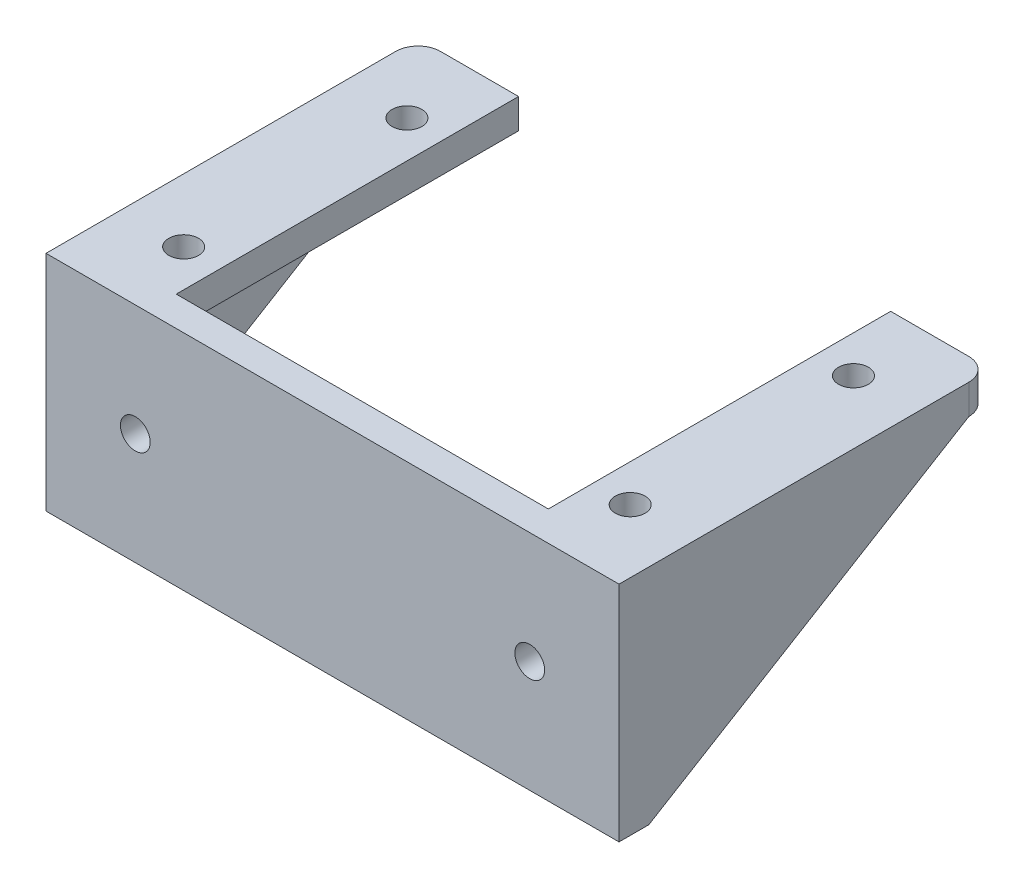
ISO-10303-21;
HEADER;
FILE_DESCRIPTION(('STEP AP214'),'2;1');
FILE_NAME('part.step','',(''),(''),'','','');
FILE_SCHEMA(('AUTOMOTIVE_DESIGN { 1 0 10303 214 1 1 1 1 }'));
ENDSEC;
DATA;
#1=APPLICATION_CONTEXT('core data for automotive mechanical design processes');
#2=APPLICATION_PROTOCOL_DEFINITION('international standard','automotive_design',2000,#1);
#3=PRODUCT_CONTEXT('',#1,'mechanical');
#4=PRODUCT('Part','Part','',(#3));
#5=PRODUCT_RELATED_PRODUCT_CATEGORY('part','',(#4));
#6=PRODUCT_DEFINITION_FORMATION('','',#4);
#7=PRODUCT_DEFINITION_CONTEXT('part definition',#1,'design');
#8=PRODUCT_DEFINITION('design','',#6,#7);
#9=PRODUCT_DEFINITION_SHAPE('','',#8);
#10=(LENGTH_UNIT() NAMED_UNIT(*) SI_UNIT(.MILLI.,.METRE.));
#11=(NAMED_UNIT(*) PLANE_ANGLE_UNIT() SI_UNIT($,.RADIAN.));
#12=(NAMED_UNIT(*) SI_UNIT($,.STERADIAN.) SOLID_ANGLE_UNIT());
#13=UNCERTAINTY_MEASURE_WITH_UNIT(LENGTH_MEASURE(1.E-05),#10,'distance_accuracy_value','');
#14=(GEOMETRIC_REPRESENTATION_CONTEXT(3) GLOBAL_UNCERTAINTY_ASSIGNED_CONTEXT((#13)) GLOBAL_UNIT_ASSIGNED_CONTEXT((#10,
#11,#12)) REPRESENTATION_CONTEXT('',''));
#15=CARTESIAN_POINT('',(0.,0.,0.));
#16=DIRECTION('',(0.,0.,1.));
#17=DIRECTION('',(1.,0.,0.));
#18=AXIS2_PLACEMENT_3D('',#15,#16,#17);
#19=CARTESIAN_POINT('',(25.,4.,21.));
#20=DIRECTION('',(0.,0.,1.));
#21=DIRECTION('',(1.,0.,0.));
#22=AXIS2_PLACEMENT_3D('',#19,#20,#21);
#23=PLANE('',#22);
#24=CARTESIAN_POINT('',(-26.5,-11.,21.));
#25=DIRECTION('',(0.,0.,1.));
#26=DIRECTION('',(1.,0.,0.));
#27=AXIS2_PLACEMENT_3D('',#24,#25,#26);
#28=CIRCLE('',#27,2.);
#29=CARTESIAN_POINT('',(-24.5,-11.,21.));
#30=VERTEX_POINT('',#29);
#31=EDGE_CURVE('E291',#30,#30,#28,.F.);
#32=ORIENTED_EDGE('',*,*,#31,.F.);
#33=EDGE_LOOP('',(#32));
#34=FACE_BOUND('',#33,.T.);
#35=CARTESIAN_POINT('',(26.5,-11.,21.));
#36=DIRECTION('',(0.,0.,1.));
#37=DIRECTION('',(1.,0.,0.));
#38=AXIS2_PLACEMENT_3D('',#35,#36,#37);
#39=CIRCLE('',#38,2.);
#40=CARTESIAN_POINT('',(28.5,-11.,21.));
#41=VERTEX_POINT('',#40);
#42=EDGE_CURVE('E190',#41,#41,#39,.F.);
#43=ORIENTED_EDGE('',*,*,#42,.F.);
#44=EDGE_LOOP('',(#43));
#45=FACE_BOUND('',#44,.T.);
#46=DIRECTION('',(1.,0.,0.));
#47=VECTOR('',#46,1.);
#48=CARTESIAN_POINT('',(38.5,0.,21.));
#49=LINE('',#48,#47);
#50=CARTESIAN_POINT('',(25.,0.,21.));
#51=VERTEX_POINT('',#50);
#52=CARTESIAN_POINT('',(34.5,0.,21.));
#53=VERTEX_POINT('',#52);
#54=EDGE_CURVE('E170',#51,#53,#49,.T.);
#55=ORIENTED_EDGE('',*,*,#54,.T.);
#56=DIRECTION('',(0.,-1.,0.));
#57=VECTOR('',#56,1.);
#58=CARTESIAN_POINT('',(34.5,0.,21.));
#59=LINE('',#58,#57);
#60=CARTESIAN_POINT('',(34.5,-26.,21.));
#61=VERTEX_POINT('',#60);
#62=EDGE_CURVE('E158',#53,#61,#59,.T.);
#63=ORIENTED_EDGE('',*,*,#62,.T.);
#64=DIRECTION('',(1.,0.,0.));
#65=VECTOR('',#64,1.);
#66=CARTESIAN_POINT('',(38.5,-26.,21.));
#67=LINE('',#66,#65);
#68=CARTESIAN_POINT('',(-34.5,-26.,21.));
#69=VERTEX_POINT('',#68);
#70=EDGE_CURVE('E167',#69,#61,#67,.T.);
#71=ORIENTED_EDGE('',*,*,#70,.F.);
#72=DIRECTION('',(0.,1.,0.));
#73=VECTOR('',#72,1.);
#74=CARTESIAN_POINT('',(-34.5,-26.,21.));
#75=LINE('',#74,#73);
#76=CARTESIAN_POINT('',(-34.5,0.,21.));
#77=VERTEX_POINT('',#76);
#78=EDGE_CURVE('E318',#69,#77,#75,.T.);
#79=ORIENTED_EDGE('',*,*,#78,.T.);
#80=CARTESIAN_POINT('',(-25.,0.,21.));
#81=VERTEX_POINT('',#80);
#82=EDGE_CURVE('E186',#77,#81,#49,.T.);
#83=ORIENTED_EDGE('',*,*,#82,.T.);
#84=DIRECTION('',(0.,-1.,0.));
#85=VECTOR('',#84,1.);
#86=CARTESIAN_POINT('',(-25.,4.,21.));
#87=LINE('',#86,#85);
#88=CARTESIAN_POINT('',(-25.,4.,21.));
#89=VERTEX_POINT('',#88);
#90=EDGE_CURVE('E219',#89,#81,#87,.T.);
#91=ORIENTED_EDGE('',*,*,#90,.F.);
#92=DIRECTION('',(-1.,0.,0.));
#93=VECTOR('',#92,1.);
#94=CARTESIAN_POINT('',(25.,4.,21.));
#95=LINE('',#94,#93);
#96=CARTESIAN_POINT('',(25.,4.,21.));
#97=VERTEX_POINT('',#96);
#98=EDGE_CURVE('E195',#97,#89,#95,.T.);
#99=ORIENTED_EDGE('',*,*,#98,.F.);
#100=DIRECTION('',(0.,-1.,0.));
#101=VECTOR('',#100,1.);
#102=CARTESIAN_POINT('',(25.,4.,21.));
#103=LINE('',#102,#101);
#104=EDGE_CURVE('E204',#97,#51,#103,.T.);
#105=ORIENTED_EDGE('',*,*,#104,.T.);
#106=EDGE_LOOP('',(#55,#63,#71,#79,#83,#91,#99,#105));
#107=FACE_BOUND('',#106,.T.);
#108=ADVANCED_FACE('F39',(#34,#45,#107),#23,.F.);
#109=CARTESIAN_POINT('',(0.,0.,0.));
#110=DIRECTION('',(0.,-1.,0.));
#111=DIRECTION('',(0.,0.,-1.));
#112=AXIS2_PLACEMENT_3D('',#109,#110,#111);
#113=PLANE('',#112);
#114=CARTESIAN_POINT('',(-30.,0.,15.));
#115=DIRECTION('',(0.,-1.,0.));
#116=DIRECTION('',(0.,0.,-1.));
#117=AXIS2_PLACEMENT_3D('',#114,#115,#116);
#118=CIRCLE('',#117,2.);
#119=CARTESIAN_POINT('',(-30.,0.,13.));
#120=VERTEX_POINT('',#119);
#121=EDGE_CURVE('E347',#120,#120,#118,.F.);
#122=ORIENTED_EDGE('',*,*,#121,.T.);
#123=EDGE_LOOP('',(#122));
#124=FACE_BOUND('',#123,.T.);
#125=CARTESIAN_POINT('',(-30.,0.,-15.));
#126=DIRECTION('',(0.,-1.,0.));
#127=DIRECTION('',(0.,0.,-1.));
#128=AXIS2_PLACEMENT_3D('',#125,#126,#127);
#129=CIRCLE('',#128,2.);
#130=CARTESIAN_POINT('',(-30.,0.,-17.));
#131=VERTEX_POINT('',#130);
#132=EDGE_CURVE('E330',#131,#131,#129,.F.);
#133=ORIENTED_EDGE('',*,*,#132,.T.);
#134=EDGE_LOOP('',(#133));
#135=FACE_BOUND('',#134,.T.);
#136=DIRECTION('',(-1.,0.,0.));
#137=VECTOR('',#136,1.);
#138=CARTESIAN_POINT('',(-34.5,0.,-22.));
#139=LINE('',#138,#137);
#140=CARTESIAN_POINT('',(-34.5,0.,-22.));
#141=VERTEX_POINT('',#140);
#142=CARTESIAN_POINT('',(-38.5,0.,-22.));
#143=VERTEX_POINT('',#142);
#144=EDGE_CURVE('E300',#141,#143,#139,.T.);
#145=ORIENTED_EDGE('',*,*,#144,.T.);
#146=CARTESIAN_POINT('',(-35.5,0.,-22.));
#147=DIRECTION('',(0.,-1.,0.));
#148=DIRECTION('',(0.,0.,-1.));
#149=AXIS2_PLACEMENT_3D('',#146,#147,#148);
#150=CIRCLE('',#149,3.);
#151=CARTESIAN_POINT('',(-35.5,0.,-25.));
#152=VERTEX_POINT('',#151);
#153=EDGE_CURVE('E252',#143,#152,#150,.T.);
#154=ORIENTED_EDGE('',*,*,#153,.T.);
#155=DIRECTION('',(-1.,0.,0.));
#156=VECTOR('',#155,1.);
#157=CARTESIAN_POINT('',(-38.5,0.,-25.));
#158=LINE('',#157,#156);
#159=CARTESIAN_POINT('',(-25.,0.,-25.));
#160=VERTEX_POINT('',#159);
#161=EDGE_CURVE('E214',#160,#152,#158,.T.);
#162=ORIENTED_EDGE('',*,*,#161,.F.);
#163=DIRECTION('',(0.,0.,-1.));
#164=VECTOR('',#163,1.);
#165=CARTESIAN_POINT('',(-25.,0.,-25.));
#166=LINE('',#165,#164);
#167=EDGE_CURVE('E196',#81,#160,#166,.T.);
#168=ORIENTED_EDGE('',*,*,#167,.F.);
#169=ORIENTED_EDGE('',*,*,#82,.F.);
#170=DIRECTION('',(0.,0.,-1.));
#171=VECTOR('',#170,1.);
#172=CARTESIAN_POINT('',(-34.5,0.,21.));
#173=LINE('',#172,#171);
#174=EDGE_CURVE('E310',#77,#141,#173,.T.);
#175=ORIENTED_EDGE('',*,*,#174,.T.);
#176=EDGE_LOOP('',(#145,#154,#162,#168,#169,#175));
#177=FACE_BOUND('',#176,.T.);
#178=ADVANCED_FACE('F387',(#124,#135,#177),#113,.T.);
#179=CARTESIAN_POINT('',(-38.5,4.,-25.));
#180=DIRECTION('',(0.,0.,1.));
#181=DIRECTION('',(1.,0.,0.));
#182=AXIS2_PLACEMENT_3D('',#179,#180,#181);
#183=PLANE('',#182);
#184=DIRECTION('',(-1.,0.,0.));
#185=VECTOR('',#184,1.);
#186=CARTESIAN_POINT('',(-38.5,4.,-25.));
#187=LINE('',#186,#185);
#188=CARTESIAN_POINT('',(35.5,4.,-25.));
#189=VERTEX_POINT('',#188);
#190=CARTESIAN_POINT('',(25.,4.,-25.));
#191=VERTEX_POINT('',#190);
#192=EDGE_CURVE('E231',#189,#191,#187,.T.);
#193=ORIENTED_EDGE('',*,*,#192,.F.);
#194=DIRECTION('',(0.,-1.,0.));
#195=VECTOR('',#194,1.);
#196=CARTESIAN_POINT('',(35.5,4.,-25.));
#197=LINE('',#196,#195);
#198=CARTESIAN_POINT('',(35.5,0.,-25.));
#199=VERTEX_POINT('',#198);
#200=EDGE_CURVE('E264',#189,#199,#197,.T.);
#201=ORIENTED_EDGE('',*,*,#200,.T.);
#202=CARTESIAN_POINT('',(25.,0.,-25.));
#203=VERTEX_POINT('',#202);
#204=EDGE_CURVE('E230',#199,#203,#158,.T.);
#205=ORIENTED_EDGE('',*,*,#204,.T.);
#206=DIRECTION('',(0.,-1.,0.));
#207=VECTOR('',#206,1.);
#208=CARTESIAN_POINT('',(25.,4.,-25.));
#209=LINE('',#208,#207);
#210=EDGE_CURVE('E210',#191,#203,#209,.T.);
#211=ORIENTED_EDGE('',*,*,#210,.F.);
#212=EDGE_LOOP('',(#193,#201,#205,#211));
#213=FACE_BOUND('',#212,.T.);
#214=ADVANCED_FACE('F393',(#213),#183,.F.);
#215=CARTESIAN_POINT('',(38.5,4.,25.));
#216=DIRECTION('',(-1.,0.,0.));
#217=DIRECTION('',(0.,0.,1.));
#218=AXIS2_PLACEMENT_3D('',#215,#216,#217);
#219=PLANE('',#218);
#220=DIRECTION('',(0.,0.,1.));
#221=VECTOR('',#220,1.);
#222=CARTESIAN_POINT('',(38.5,-26.,25.));
#223=LINE('',#222,#221);
#224=CARTESIAN_POINT('',(38.5,-26.,21.));
#225=VERTEX_POINT('',#224);
#226=CARTESIAN_POINT('',(38.5,-26.,25.));
#227=VERTEX_POINT('',#226);
#228=EDGE_CURVE('E189',#225,#227,#223,.T.);
#229=ORIENTED_EDGE('',*,*,#228,.F.);
#230=DIRECTION('',(0.,0.517419338909194,-0.855731983580591));
#231=VECTOR('',#230,1.);
#232=CARTESIAN_POINT('',(38.5,-26.,21.));
#233=LINE('',#232,#231);
#234=CARTESIAN_POINT('',(38.5,0.,-22.));
#235=VERTEX_POINT('',#234);
#236=EDGE_CURVE('E146',#225,#235,#233,.T.);
#237=ORIENTED_EDGE('',*,*,#236,.T.);
#238=DIRECTION('',(0.,-1.,0.));
#239=VECTOR('',#238,1.);
#240=CARTESIAN_POINT('',(38.5,4.,-22.));
#241=LINE('',#240,#239);
#242=CARTESIAN_POINT('',(38.5,4.,-22.));
#243=VERTEX_POINT('',#242);
#244=EDGE_CURVE('E11',#235,#243,#241,.F.);
#245=ORIENTED_EDGE('',*,*,#244,.T.);
#246=DIRECTION('',(0.,0.,-1.));
#247=VECTOR('',#246,1.);
#248=CARTESIAN_POINT('',(38.5,4.,25.));
#249=LINE('',#248,#247);
#250=CARTESIAN_POINT('',(38.5,4.,25.));
#251=VERTEX_POINT('',#250);
#252=EDGE_CURVE('E225',#251,#243,#249,.T.);
#253=ORIENTED_EDGE('',*,*,#252,.F.);
#254=DIRECTION('',(0.,-1.,0.));
#255=VECTOR('',#254,1.);
#256=CARTESIAN_POINT('',(38.5,4.,25.));
#257=LINE('',#256,#255);
#258=EDGE_CURVE('E240',#251,#227,#257,.T.);
#259=ORIENTED_EDGE('',*,*,#258,.T.);
#260=EDGE_LOOP('',(#229,#237,#245,#253,#259));
#261=FACE_BOUND('',#260,.T.);
#262=ADVANCED_FACE('F274',(#261),#219,.F.);
#263=ORIENTED_EDGE('',*,*,#161,.T.);
#264=DIRECTION('',(0.,-1.,0.));
#265=VECTOR('',#264,1.);
#266=CARTESIAN_POINT('',(-35.5,4.,-25.));
#267=LINE('',#266,#265);
#268=CARTESIAN_POINT('',(-35.5,4.,-25.));
#269=VERTEX_POINT('',#268);
#270=EDGE_CURVE('E255',#152,#269,#267,.F.);
#271=ORIENTED_EDGE('',*,*,#270,.T.);
#272=CARTESIAN_POINT('',(-25.,4.,-25.));
#273=VERTEX_POINT('',#272);
#274=EDGE_CURVE('E229',#273,#269,#187,.T.);
#275=ORIENTED_EDGE('',*,*,#274,.F.);
#276=DIRECTION('',(0.,-1.,0.));
#277=VECTOR('',#276,1.);
#278=CARTESIAN_POINT('',(-25.,4.,-25.));
#279=LINE('',#278,#277);
#280=EDGE_CURVE('E215',#273,#160,#279,.T.);
#281=ORIENTED_EDGE('',*,*,#280,.T.);
#282=EDGE_LOOP('',(#263,#271,#275,#281));
#283=FACE_BOUND('',#282,.T.);
#284=ADVANCED_FACE('F414',(#283),#183,.F.);
#285=CARTESIAN_POINT('',(-38.5,4.,25.));
#286=DIRECTION('',(1.,0.,0.));
#287=DIRECTION('',(0.,0.,-1.));
#288=AXIS2_PLACEMENT_3D('',#285,#286,#287);
#289=PLANE('',#288);
#290=DIRECTION('',(0.,0.,1.));
#291=VECTOR('',#290,1.);
#292=CARTESIAN_POINT('',(-38.5,4.,25.));
#293=LINE('',#292,#291);
#294=CARTESIAN_POINT('',(-38.5,4.,-22.));
#295=VERTEX_POINT('',#294);
#296=CARTESIAN_POINT('',(-38.5,4.,25.));
#297=VERTEX_POINT('',#296);
#298=EDGE_CURVE('E234',#295,#297,#293,.T.);
#299=ORIENTED_EDGE('',*,*,#298,.F.);
#300=DIRECTION('',(0.,-1.,0.));
#301=VECTOR('',#300,1.);
#302=CARTESIAN_POINT('',(-38.5,4.,-22.));
#303=LINE('',#302,#301);
#304=EDGE_CURVE('E248',#295,#143,#303,.T.);
#305=ORIENTED_EDGE('',*,*,#304,.T.);
#306=DIRECTION('',(0.,-0.517419338909194,0.855731983580591));
#307=VECTOR('',#306,1.);
#308=CARTESIAN_POINT('',(-38.5,0.,-22.));
#309=LINE('',#308,#307);
#310=CARTESIAN_POINT('',(-38.5,-26.,21.));
#311=VERTEX_POINT('',#310);
#312=EDGE_CURVE('E311',#143,#311,#309,.T.);
#313=ORIENTED_EDGE('',*,*,#312,.T.);
#314=DIRECTION('',(0.,0.,-1.));
#315=VECTOR('',#314,1.);
#316=CARTESIAN_POINT('',(-38.5,-26.,25.));
#317=LINE('',#316,#315);
#318=CARTESIAN_POINT('',(-38.5,-26.,25.));
#319=VERTEX_POINT('',#318);
#320=EDGE_CURVE('E177',#319,#311,#317,.T.);
#321=ORIENTED_EDGE('',*,*,#320,.F.);
#322=DIRECTION('',(0.,-1.,0.));
#323=VECTOR('',#322,1.);
#324=CARTESIAN_POINT('',(-38.5,4.,25.));
#325=LINE('',#324,#323);
#326=EDGE_CURVE('E245',#297,#319,#325,.T.);
#327=ORIENTED_EDGE('',*,*,#326,.F.);
#328=EDGE_LOOP('',(#299,#305,#313,#321,#327));
#329=FACE_BOUND('',#328,.T.);
#330=ADVANCED_FACE('F410',(#329),#289,.F.);
#331=CARTESIAN_POINT('',(-38.5,4.,25.));
#332=DIRECTION('',(0.,0.,-1.));
#333=DIRECTION('',(-1.,0.,0.));
#334=AXIS2_PLACEMENT_3D('',#331,#332,#333);
#335=PLANE('',#334);
#336=CARTESIAN_POINT('',(26.5,-11.,25.));
#337=DIRECTION('',(0.,0.,1.));
#338=DIRECTION('',(1.,0.,0.));
#339=AXIS2_PLACEMENT_3D('',#336,#337,#338);
#340=CIRCLE('',#339,2.);
#341=CARTESIAN_POINT('',(28.5,-11.,25.));
#342=VERTEX_POINT('',#341);
#343=EDGE_CURVE('E295',#342,#342,#340,.T.);
#344=ORIENTED_EDGE('',*,*,#343,.F.);
#345=EDGE_LOOP('',(#344));
#346=FACE_BOUND('',#345,.T.);
#347=CARTESIAN_POINT('',(-26.5,-11.,25.));
#348=DIRECTION('',(0.,0.,1.));
#349=DIRECTION('',(1.,0.,0.));
#350=AXIS2_PLACEMENT_3D('',#347,#348,#349);
#351=CIRCLE('',#350,2.);
#352=CARTESIAN_POINT('',(-24.5,-11.,25.));
#353=VERTEX_POINT('',#352);
#354=EDGE_CURVE('E296',#353,#353,#351,.T.);
#355=ORIENTED_EDGE('',*,*,#354,.F.);
#356=EDGE_LOOP('',(#355));
#357=FACE_BOUND('',#356,.T.);
#358=ORIENTED_EDGE('',*,*,#326,.T.);
#359=DIRECTION('',(-1.,0.,0.));
#360=VECTOR('',#359,1.);
#361=CARTESIAN_POINT('',(38.5,-26.,25.));
#362=LINE('',#361,#360);
#363=EDGE_CURVE('E182',#227,#319,#362,.T.);
#364=ORIENTED_EDGE('',*,*,#363,.F.);
#365=ORIENTED_EDGE('',*,*,#258,.F.);
#366=DIRECTION('',(1.,0.,0.));
#367=VECTOR('',#366,1.);
#368=CARTESIAN_POINT('',(-38.5,4.,25.));
#369=LINE('',#368,#367);
#370=EDGE_CURVE('E237',#297,#251,#369,.T.);
#371=ORIENTED_EDGE('',*,*,#370,.F.);
#372=EDGE_LOOP('',(#358,#364,#365,#371));
#373=FACE_BOUND('',#372,.T.);
#374=ADVANCED_FACE('F285',(#346,#357,#373),#335,.F.);
#375=CARTESIAN_POINT('',(0.,4.,0.));
#376=DIRECTION('',(0.,-1.,0.));
#377=DIRECTION('',(0.,0.,-1.));
#378=AXIS2_PLACEMENT_3D('',#375,#376,#377);
#379=PLANE('',#378);
#380=CARTESIAN_POINT('',(-30.,4.,15.));
#381=DIRECTION('',(0.,1.,0.));
#382=DIRECTION('',(0.,0.,1.));
#383=AXIS2_PLACEMENT_3D('',#380,#381,#382);
#384=CIRCLE('',#383,2.);
#385=CARTESIAN_POINT('',(-30.,4.,17.));
#386=VERTEX_POINT('',#385);
#387=EDGE_CURVE('E334',#386,#386,#384,.T.);
#388=ORIENTED_EDGE('',*,*,#387,.F.);
#389=EDGE_LOOP('',(#388));
#390=FACE_BOUND('',#389,.T.);
#391=CARTESIAN_POINT('',(30.,4.,-15.));
#392=DIRECTION('',(0.,1.,0.));
#393=DIRECTION('',(0.,0.,1.));
#394=AXIS2_PLACEMENT_3D('',#391,#392,#393);
#395=CIRCLE('',#394,2.);
#396=CARTESIAN_POINT('',(30.,4.,-13.));
#397=VERTEX_POINT('',#396);
#398=EDGE_CURVE('E342',#397,#397,#395,.T.);
#399=ORIENTED_EDGE('',*,*,#398,.F.);
#400=EDGE_LOOP('',(#399));
#401=FACE_BOUND('',#400,.T.);
#402=CARTESIAN_POINT('',(30.,4.,15.));
#403=DIRECTION('',(0.,1.,0.));
#404=DIRECTION('',(0.,0.,1.));
#405=AXIS2_PLACEMENT_3D('',#402,#403,#404);
#406=CIRCLE('',#405,2.);
#407=CARTESIAN_POINT('',(30.,4.,17.));
#408=VERTEX_POINT('',#407);
#409=EDGE_CURVE('E343',#408,#408,#406,.T.);
#410=ORIENTED_EDGE('',*,*,#409,.F.);
#411=EDGE_LOOP('',(#410));
#412=FACE_BOUND('',#411,.T.);
#413=CARTESIAN_POINT('',(-30.,4.,-15.));
#414=DIRECTION('',(0.,1.,0.));
#415=DIRECTION('',(0.,0.,1.));
#416=AXIS2_PLACEMENT_3D('',#413,#414,#415);
#417=CIRCLE('',#416,2.);
#418=CARTESIAN_POINT('',(-30.,4.,-13.));
#419=VERTEX_POINT('',#418);
#420=EDGE_CURVE('E327',#419,#419,#417,.T.);
#421=ORIENTED_EDGE('',*,*,#420,.F.);
#422=EDGE_LOOP('',(#421));
#423=FACE_BOUND('',#422,.T.);
#424=ORIENTED_EDGE('',*,*,#274,.T.);
#425=CARTESIAN_POINT('',(-35.5,4.,-22.));
#426=DIRECTION('',(0.,-1.,0.));
#427=DIRECTION('',(0.,0.,-1.));
#428=AXIS2_PLACEMENT_3D('',#425,#426,#427);
#429=CIRCLE('',#428,3.);
#430=EDGE_CURVE('E261',#269,#295,#429,.F.);
#431=ORIENTED_EDGE('',*,*,#430,.T.);
#432=ORIENTED_EDGE('',*,*,#298,.T.);
#433=ORIENTED_EDGE('',*,*,#370,.T.);
#434=ORIENTED_EDGE('',*,*,#252,.T.);
#435=CARTESIAN_POINT('',(35.5,4.,-22.));
#436=DIRECTION('',(0.,-1.,0.));
#437=DIRECTION('',(0.,0.,-1.));
#438=AXIS2_PLACEMENT_3D('',#435,#436,#437);
#439=CIRCLE('',#438,3.);
#440=EDGE_CURVE('E258',#243,#189,#439,.F.);
#441=ORIENTED_EDGE('',*,*,#440,.T.);
#442=ORIENTED_EDGE('',*,*,#192,.T.);
#443=DIRECTION('',(0.,0.,1.));
#444=VECTOR('',#443,1.);
#445=CARTESIAN_POINT('',(25.,4.,-25.));
#446=LINE('',#445,#444);
#447=EDGE_CURVE('E191',#191,#97,#446,.T.);
#448=ORIENTED_EDGE('',*,*,#447,.T.);
#449=ORIENTED_EDGE('',*,*,#98,.T.);
#450=DIRECTION('',(0.,0.,-1.));
#451=VECTOR('',#450,1.);
#452=CARTESIAN_POINT('',(-25.,4.,-25.));
#453=LINE('',#452,#451);
#454=EDGE_CURVE('E200',#89,#273,#453,.T.);
#455=ORIENTED_EDGE('',*,*,#454,.T.);
#456=EDGE_LOOP('',(#424,#431,#432,#433,#434,#441,#442,#448,#449,#455));
#457=FACE_BOUND('',#456,.T.);
#458=ADVANCED_FACE('F277',(#390,#401,#412,#423,#457),#379,.F.);
#459=CARTESIAN_POINT('',(30.,0.,-15.));
#460=DIRECTION('',(0.,-1.,0.));
#461=DIRECTION('',(0.,0.,-1.));
#462=AXIS2_PLACEMENT_3D('',#459,#460,#461);
#463=CIRCLE('',#462,2.);
#464=CARTESIAN_POINT('',(30.,0.,-17.));
#465=VERTEX_POINT('',#464);
#466=EDGE_CURVE('E338',#465,#465,#463,.F.);
#467=ORIENTED_EDGE('',*,*,#466,.T.);
#468=EDGE_LOOP('',(#467));
#469=FACE_BOUND('',#468,.T.);
#470=CARTESIAN_POINT('',(30.,0.,15.));
#471=DIRECTION('',(0.,-1.,0.));
#472=DIRECTION('',(0.,0.,-1.));
#473=AXIS2_PLACEMENT_3D('',#470,#471,#472);
#474=CIRCLE('',#473,2.);
#475=CARTESIAN_POINT('',(30.,0.,13.));
#476=VERTEX_POINT('',#475);
#477=EDGE_CURVE('E354',#476,#476,#474,.F.);
#478=ORIENTED_EDGE('',*,*,#477,.T.);
#479=EDGE_LOOP('',(#478));
#480=FACE_BOUND('',#479,.T.);
#481=DIRECTION('',(1.,0.,0.));
#482=VECTOR('',#481,1.);
#483=CARTESIAN_POINT('',(34.5,0.,-22.));
#484=LINE('',#483,#482);
#485=CARTESIAN_POINT('',(34.5,0.,-22.));
#486=VERTEX_POINT('',#485);
#487=EDGE_CURVE('E152',#486,#235,#484,.T.);
#488=ORIENTED_EDGE('',*,*,#487,.F.);
#489=DIRECTION('',(0.,0.,1.));
#490=VECTOR('',#489,1.);
#491=CARTESIAN_POINT('',(34.5,0.,-22.));
#492=LINE('',#491,#490);
#493=EDGE_CURVE('E153',#486,#53,#492,.T.);
#494=ORIENTED_EDGE('',*,*,#493,.T.);
#495=ORIENTED_EDGE('',*,*,#54,.F.);
#496=DIRECTION('',(0.,0.,1.));
#497=VECTOR('',#496,1.);
#498=CARTESIAN_POINT('',(25.,0.,-25.));
#499=LINE('',#498,#497);
#500=EDGE_CURVE('E181',#203,#51,#499,.T.);
#501=ORIENTED_EDGE('',*,*,#500,.F.);
#502=ORIENTED_EDGE('',*,*,#204,.F.);
#503=CARTESIAN_POINT('',(35.5,0.,-22.));
#504=DIRECTION('',(0.,-1.,0.));
#505=DIRECTION('',(0.,0.,-1.));
#506=AXIS2_PLACEMENT_3D('',#503,#504,#505);
#507=CIRCLE('',#506,3.);
#508=EDGE_CURVE('E48',#199,#235,#507,.T.);
#509=ORIENTED_EDGE('',*,*,#508,.T.);
#510=EDGE_LOOP('',(#488,#494,#495,#501,#502,#509));
#511=FACE_BOUND('',#510,.T.);
#512=ADVANCED_FACE('F269',(#469,#480,#511),#113,.T.);
#513=CARTESIAN_POINT('',(25.,4.,-25.));
#514=DIRECTION('',(1.,0.,0.));
#515=DIRECTION('',(0.,0.,-1.));
#516=AXIS2_PLACEMENT_3D('',#513,#514,#515);
#517=PLANE('',#516);
#518=ORIENTED_EDGE('',*,*,#500,.T.);
#519=ORIENTED_EDGE('',*,*,#104,.F.);
#520=ORIENTED_EDGE('',*,*,#447,.F.);
#521=ORIENTED_EDGE('',*,*,#210,.T.);
#522=EDGE_LOOP('',(#518,#519,#520,#521));
#523=FACE_BOUND('',#522,.T.);
#524=ADVANCED_FACE('F402',(#523),#517,.F.);
#525=CARTESIAN_POINT('',(-25.,4.,-25.));
#526=DIRECTION('',(-1.,0.,0.));
#527=DIRECTION('',(0.,0.,1.));
#528=AXIS2_PLACEMENT_3D('',#525,#526,#527);
#529=PLANE('',#528);
#530=ORIENTED_EDGE('',*,*,#167,.T.);
#531=ORIENTED_EDGE('',*,*,#280,.F.);
#532=ORIENTED_EDGE('',*,*,#454,.F.);
#533=ORIENTED_EDGE('',*,*,#90,.T.);
#534=EDGE_LOOP('',(#530,#531,#532,#533));
#535=FACE_BOUND('',#534,.T.);
#536=ADVANCED_FACE('F400',(#535),#529,.F.);
#537=CARTESIAN_POINT('',(0.,-26.,0.));
#538=DIRECTION('',(0.,1.,0.));
#539=DIRECTION('',(0.,0.,1.));
#540=AXIS2_PLACEMENT_3D('',#537,#538,#539);
#541=PLANE('',#540);
#542=ORIENTED_EDGE('',*,*,#228,.T.);
#543=ORIENTED_EDGE('',*,*,#363,.T.);
#544=ORIENTED_EDGE('',*,*,#320,.T.);
#545=EDGE_CURVE('E175',#311,#69,#67,.T.);
#546=ORIENTED_EDGE('',*,*,#545,.T.);
#547=ORIENTED_EDGE('',*,*,#70,.T.);
#548=DIRECTION('',(1.,0.,0.));
#549=VECTOR('',#548,1.);
#550=CARTESIAN_POINT('',(34.5,-26.,21.));
#551=LINE('',#550,#549);
#552=EDGE_CURVE('E140',#61,#225,#551,.T.);
#553=ORIENTED_EDGE('',*,*,#552,.T.);
#554=EDGE_LOOP('',(#542,#543,#544,#546,#547,#553));
#555=FACE_BOUND('',#554,.T.);
#556=ADVANCED_FACE('F173',(#555),#541,.F.);
#557=CARTESIAN_POINT('',(-26.5,-11.,-25.001));
#558=DIRECTION('',(0.,0.,1.));
#559=DIRECTION('',(1.,0.,0.));
#560=AXIS2_PLACEMENT_3D('',#557,#558,#559);
#561=CYLINDRICAL_SURFACE('',#560,2.);
#562=ORIENTED_EDGE('',*,*,#354,.T.);
#563=EDGE_LOOP('',(#562));
#564=FACE_BOUND('',#563,.T.);
#565=ORIENTED_EDGE('',*,*,#31,.T.);
#566=EDGE_LOOP('',(#565));
#567=FACE_BOUND('',#566,.T.);
#568=ADVANCED_FACE('F429',(#564,#567),#561,.F.);
#569=CARTESIAN_POINT('',(26.5,-11.,-25.001));
#570=DIRECTION('',(0.,0.,1.));
#571=DIRECTION('',(1.,0.,0.));
#572=AXIS2_PLACEMENT_3D('',#569,#570,#571);
#573=CYLINDRICAL_SURFACE('',#572,2.);
#574=ORIENTED_EDGE('',*,*,#343,.T.);
#575=EDGE_LOOP('',(#574));
#576=FACE_BOUND('',#575,.T.);
#577=ORIENTED_EDGE('',*,*,#42,.T.);
#578=EDGE_LOOP('',(#577));
#579=FACE_BOUND('',#578,.T.);
#580=ADVANCED_FACE('F422',(#576,#579),#573,.F.);
#581=CARTESIAN_POINT('',(-35.5,4.,-22.));
#582=DIRECTION('',(0.,-1.,0.));
#583=DIRECTION('',(0.,0.,-1.));
#584=AXIS2_PLACEMENT_3D('',#581,#582,#583);
#585=CYLINDRICAL_SURFACE('',#584,3.);
#586=ORIENTED_EDGE('',*,*,#430,.F.);
#587=ORIENTED_EDGE('',*,*,#270,.F.);
#588=ORIENTED_EDGE('',*,*,#153,.F.);
#589=ORIENTED_EDGE('',*,*,#304,.F.);
#590=EDGE_LOOP('',(#586,#587,#588,#589));
#591=FACE_BOUND('',#590,.T.);
#592=ADVANCED_FACE('F420',(#591),#585,.T.);
#593=CARTESIAN_POINT('',(35.5,4.,-22.));
#594=DIRECTION('',(0.,-1.,0.));
#595=DIRECTION('',(0.,0.,-1.));
#596=AXIS2_PLACEMENT_3D('',#593,#594,#595);
#597=CYLINDRICAL_SURFACE('',#596,3.);
#598=ORIENTED_EDGE('',*,*,#440,.F.);
#599=ORIENTED_EDGE('',*,*,#244,.F.);
#600=ORIENTED_EDGE('',*,*,#508,.F.);
#601=ORIENTED_EDGE('',*,*,#200,.F.);
#602=EDGE_LOOP('',(#598,#599,#600,#601));
#603=FACE_BOUND('',#602,.T.);
#604=ADVANCED_FACE('F41',(#603),#597,.T.);
#605=CARTESIAN_POINT('',(-34.5,0.,-22.));
#606=DIRECTION('',(0.,-0.855731983580591,-0.517419338909194));
#607=DIRECTION('',(0.,0.517419338909195,-0.855731983580591));
#608=AXIS2_PLACEMENT_3D('',#605,#606,#607);
#609=PLANE('',#608);
#610=ORIENTED_EDGE('',*,*,#312,.F.);
#611=ORIENTED_EDGE('',*,*,#144,.F.);
#612=DIRECTION('',(0.,-0.517419338909194,0.855731983580591));
#613=VECTOR('',#612,1.);
#614=CARTESIAN_POINT('',(-34.5,0.,-22.));
#615=LINE('',#614,#613);
#616=EDGE_CURVE('E55',#141,#69,#615,.T.);
#617=ORIENTED_EDGE('',*,*,#616,.T.);
#618=ORIENTED_EDGE('',*,*,#545,.F.);
#619=EDGE_LOOP('',(#610,#611,#617,#618));
#620=FACE_BOUND('',#619,.T.);
#621=ADVANCED_FACE('F428',(#620),#609,.T.);
#622=CARTESIAN_POINT('',(-34.5,0.,0.));
#623=DIRECTION('',(-1.,0.,0.));
#624=DIRECTION('',(0.,0.,1.));
#625=AXIS2_PLACEMENT_3D('',#622,#623,#624);
#626=PLANE('',#625);
#627=ORIENTED_EDGE('',*,*,#616,.F.);
#628=ORIENTED_EDGE('',*,*,#174,.F.);
#629=ORIENTED_EDGE('',*,*,#78,.F.);
#630=EDGE_LOOP('',(#627,#628,#629));
#631=FACE_BOUND('',#630,.T.);
#632=ADVANCED_FACE('F444',(#631),#626,.F.);
#633=CARTESIAN_POINT('',(34.5,-26.,21.));
#634=DIRECTION('',(0.,-0.855731983580591,-0.517419338909194));
#635=DIRECTION('',(0.,0.517419338909194,-0.855731983580591));
#636=AXIS2_PLACEMENT_3D('',#633,#634,#635);
#637=PLANE('',#636);
#638=ORIENTED_EDGE('',*,*,#236,.F.);
#639=ORIENTED_EDGE('',*,*,#552,.F.);
#640=DIRECTION('',(0.,0.517419338909194,-0.855731983580591));
#641=VECTOR('',#640,1.);
#642=CARTESIAN_POINT('',(34.5,-26.,21.));
#643=LINE('',#642,#641);
#644=EDGE_CURVE('E143',#61,#486,#643,.T.);
#645=ORIENTED_EDGE('',*,*,#644,.T.);
#646=ORIENTED_EDGE('',*,*,#487,.T.);
#647=EDGE_LOOP('',(#638,#639,#645,#646));
#648=FACE_BOUND('',#647,.T.);
#649=ADVANCED_FACE('F142',(#648),#637,.T.);
#650=CARTESIAN_POINT('',(34.5,0.,0.));
#651=DIRECTION('',(-1.,0.,0.));
#652=DIRECTION('',(0.,0.,1.));
#653=AXIS2_PLACEMENT_3D('',#650,#651,#652);
#654=PLANE('',#653);
#655=ORIENTED_EDGE('',*,*,#62,.F.);
#656=ORIENTED_EDGE('',*,*,#493,.F.);
#657=ORIENTED_EDGE('',*,*,#644,.F.);
#658=EDGE_LOOP('',(#655,#656,#657));
#659=FACE_BOUND('',#658,.T.);
#660=ADVANCED_FACE('F157',(#659),#654,.T.);
#661=CARTESIAN_POINT('',(30.,-26.001,15.));
#662=DIRECTION('',(0.,1.,0.));
#663=DIRECTION('',(0.,0.,1.));
#664=AXIS2_PLACEMENT_3D('',#661,#662,#663);
#665=CYLINDRICAL_SURFACE('',#664,2.);
#666=ORIENTED_EDGE('',*,*,#477,.F.);
#667=EDGE_LOOP('',(#666));
#668=FACE_BOUND('',#667,.T.);
#669=ORIENTED_EDGE('',*,*,#409,.T.);
#670=EDGE_LOOP('',(#669));
#671=FACE_BOUND('',#670,.T.);
#672=ADVANCED_FACE('F362',(#668,#671),#665,.F.);
#673=CARTESIAN_POINT('',(30.,-26.001,-15.));
#674=DIRECTION('',(0.,1.,0.));
#675=DIRECTION('',(0.,0.,1.));
#676=AXIS2_PLACEMENT_3D('',#673,#674,#675);
#677=CYLINDRICAL_SURFACE('',#676,2.);
#678=ORIENTED_EDGE('',*,*,#466,.F.);
#679=EDGE_LOOP('',(#678));
#680=FACE_BOUND('',#679,.T.);
#681=ORIENTED_EDGE('',*,*,#398,.T.);
#682=EDGE_LOOP('',(#681));
#683=FACE_BOUND('',#682,.T.);
#684=ADVANCED_FACE('F373',(#680,#683),#677,.F.);
#685=CARTESIAN_POINT('',(-30.,-26.001,-15.));
#686=DIRECTION('',(0.,1.,0.));
#687=DIRECTION('',(0.,0.,1.));
#688=AXIS2_PLACEMENT_3D('',#685,#686,#687);
#689=CYLINDRICAL_SURFACE('',#688,2.);
#690=ORIENTED_EDGE('',*,*,#132,.F.);
#691=EDGE_LOOP('',(#690));
#692=FACE_BOUND('',#691,.T.);
#693=ORIENTED_EDGE('',*,*,#420,.T.);
#694=EDGE_LOOP('',(#693));
#695=FACE_BOUND('',#694,.T.);
#696=ADVANCED_FACE('F370',(#692,#695),#689,.F.);
#697=CARTESIAN_POINT('',(-30.,-26.001,15.));
#698=DIRECTION('',(0.,1.,0.));
#699=DIRECTION('',(0.,0.,1.));
#700=AXIS2_PLACEMENT_3D('',#697,#698,#699);
#701=CYLINDRICAL_SURFACE('',#700,2.);
#702=ORIENTED_EDGE('',*,*,#121,.F.);
#703=EDGE_LOOP('',(#702));
#704=FACE_BOUND('',#703,.T.);
#705=ORIENTED_EDGE('',*,*,#387,.T.);
#706=EDGE_LOOP('',(#705));
#707=FACE_BOUND('',#706,.T.);
#708=ADVANCED_FACE('F372',(#704,#707),#701,.F.);
#709=CLOSED_SHELL('',(#108,#178,#214,#262,#284,#330,#374,#458,#512,#524,#536,#556,#568,#580,
#592,#604,#621,#632,#649,#660,#672,#684,#696,#708));
#710=MANIFOLD_SOLID_BREP('B2',#709);
#711=ADVANCED_BREP_SHAPE_REPRESENTATION('',(#18,#710),#14);
#712=SHAPE_DEFINITION_REPRESENTATION(#9,#711);
ENDSEC;
END-ISO-10303-21;
